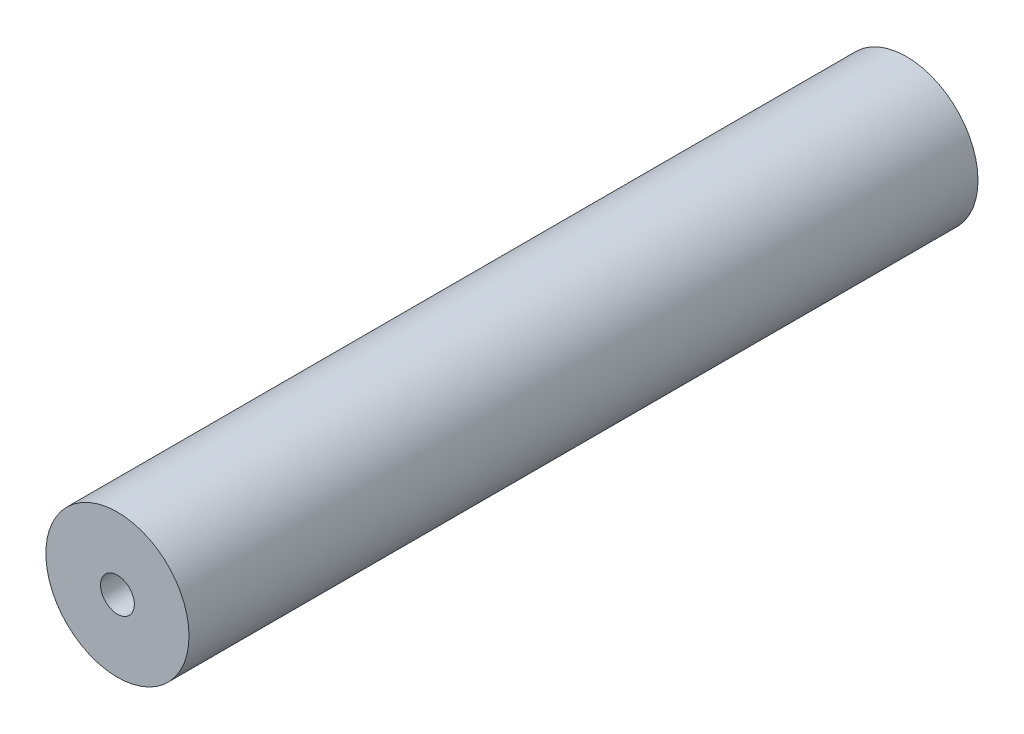
ISO-10303-21;
HEADER;
FILE_DESCRIPTION(('STEP AP214'),'2;1');
FILE_NAME('part.step','',(''),(''),'','','');
FILE_SCHEMA(('AUTOMOTIVE_DESIGN { 1 0 10303 214 1 1 1 1 }'));
ENDSEC;
DATA;
#1=APPLICATION_CONTEXT('core data for automotive mechanical design processes');
#2=APPLICATION_PROTOCOL_DEFINITION('international standard','automotive_design',2000,#1);
#3=PRODUCT_CONTEXT('',#1,'mechanical');
#4=PRODUCT('Part','Part','',(#3));
#5=PRODUCT_RELATED_PRODUCT_CATEGORY('part','',(#4));
#6=PRODUCT_DEFINITION_FORMATION('','',#4);
#7=PRODUCT_DEFINITION_CONTEXT('part definition',#1,'design');
#8=PRODUCT_DEFINITION('design','',#6,#7);
#9=PRODUCT_DEFINITION_SHAPE('','',#8);
#10=(LENGTH_UNIT() NAMED_UNIT(*) SI_UNIT(.MILLI.,.METRE.));
#11=(NAMED_UNIT(*) PLANE_ANGLE_UNIT() SI_UNIT($,.RADIAN.));
#12=(NAMED_UNIT(*) SI_UNIT($,.STERADIAN.) SOLID_ANGLE_UNIT());
#13=UNCERTAINTY_MEASURE_WITH_UNIT(LENGTH_MEASURE(1.E-05),#10,'distance_accuracy_value','');
#14=(GEOMETRIC_REPRESENTATION_CONTEXT(3) GLOBAL_UNCERTAINTY_ASSIGNED_CONTEXT((#13)) GLOBAL_UNIT_ASSIGNED_CONTEXT((#10,
#11,#12)) REPRESENTATION_CONTEXT('',''));
#15=CARTESIAN_POINT('',(0.,0.,0.));
#16=DIRECTION('',(0.,0.,1.));
#17=DIRECTION('',(1.,0.,0.));
#18=AXIS2_PLACEMENT_3D('',#15,#16,#17);
#19=CARTESIAN_POINT('',(0.,0.,70.));
#20=DIRECTION('',(0.,0.,-1.));
#21=DIRECTION('',(-1.,0.,0.));
#22=AXIS2_PLACEMENT_3D('',#19,#20,#21);
#23=CYLINDRICAL_SURFACE('',#22,6.35);
#24=CARTESIAN_POINT('',(0.,0.,70.));
#25=DIRECTION('',(0.,0.,1.));
#26=DIRECTION('',(1.,0.,0.));
#27=AXIS2_PLACEMENT_3D('',#24,#25,#26);
#28=CIRCLE('',#27,6.35);
#29=CARTESIAN_POINT('',(6.35,0.,70.));
#30=VERTEX_POINT('',#29);
#31=EDGE_CURVE('E10',#30,#30,#28,.T.);
#32=ORIENTED_EDGE('',*,*,#31,.F.);
#33=EDGE_LOOP('',(#32));
#34=FACE_BOUND('',#33,.T.);
#35=CARTESIAN_POINT('',(0.,0.,0.));
#36=DIRECTION('',(0.,0.,1.));
#37=DIRECTION('',(1.,0.,0.));
#38=AXIS2_PLACEMENT_3D('',#35,#36,#37);
#39=CIRCLE('',#38,6.35);
#40=CARTESIAN_POINT('',(6.35,0.,0.));
#41=VERTEX_POINT('',#40);
#42=EDGE_CURVE('E45',#41,#41,#39,.T.);
#43=ORIENTED_EDGE('',*,*,#42,.T.);
#44=EDGE_LOOP('',(#43));
#45=FACE_BOUND('',#44,.T.);
#46=ADVANCED_FACE('F39',(#34,#45),#23,.T.);
#47=CARTESIAN_POINT('',(0.,0.,70.));
#48=DIRECTION('',(0.,0.,1.));
#49=DIRECTION('',(1.,0.,0.));
#50=AXIS2_PLACEMENT_3D('',#47,#48,#49);
#51=PLANE('',#50);
#52=CARTESIAN_POINT('',(0.,0.,70.));
#53=DIRECTION('',(0.,0.,1.));
#54=DIRECTION('',(1.,0.,0.));
#55=AXIS2_PLACEMENT_3D('',#52,#53,#54);
#56=CIRCLE('',#55,1.5);
#57=CARTESIAN_POINT('',(1.5,0.,70.));
#58=VERTEX_POINT('',#57);
#59=EDGE_CURVE('E51',#58,#58,#56,.T.);
#60=ORIENTED_EDGE('',*,*,#59,.F.);
#61=EDGE_LOOP('',(#60));
#62=FACE_BOUND('',#61,.T.);
#63=ORIENTED_EDGE('',*,*,#31,.T.);
#64=EDGE_LOOP('',(#63));
#65=FACE_BOUND('',#64,.T.);
#66=ADVANCED_FACE('F77',(#62,#65),#51,.T.);
#67=CARTESIAN_POINT('',(0.,0.,0.));
#68=DIRECTION('',(0.,0.,1.));
#69=DIRECTION('',(1.,0.,0.));
#70=AXIS2_PLACEMENT_3D('',#67,#68,#69);
#71=PLANE('',#70);
#72=CARTESIAN_POINT('',(0.,0.,0.));
#73=DIRECTION('',(0.,0.,-1.));
#74=DIRECTION('',(-1.,0.,0.));
#75=AXIS2_PLACEMENT_3D('',#72,#73,#74);
#76=CIRCLE('',#75,1.5);
#77=CARTESIAN_POINT('',(-1.5,0.,0.));
#78=VERTEX_POINT('',#77);
#79=EDGE_CURVE('E60',#78,#78,#76,.T.);
#80=ORIENTED_EDGE('',*,*,#79,.F.);
#81=EDGE_LOOP('',(#80));
#82=FACE_BOUND('',#81,.T.);
#83=ORIENTED_EDGE('',*,*,#42,.F.);
#84=EDGE_LOOP('',(#83));
#85=FACE_BOUND('',#84,.T.);
#86=ADVANCED_FACE('F75',(#82,#85),#71,.F.);
#87=CARTESIAN_POINT('',(0.,0.,50.));
#88=DIRECTION('',(0.,0.,1.));
#89=DIRECTION('',(1.,0.,0.));
#90=AXIS2_PLACEMENT_3D('',#87,#88,#89);
#91=CYLINDRICAL_SURFACE('',#90,1.5);
#92=CARTESIAN_POINT('',(0.,0.,50.));
#93=DIRECTION('',(0.,0.,1.));
#94=DIRECTION('',(1.,0.,0.));
#95=AXIS2_PLACEMENT_3D('',#92,#93,#94);
#96=CIRCLE('',#95,1.5);
#97=CARTESIAN_POINT('',(1.5,0.,50.));
#98=VERTEX_POINT('',#97);
#99=EDGE_CURVE('E47',#98,#98,#96,.T.);
#100=ORIENTED_EDGE('',*,*,#99,.F.);
#101=EDGE_LOOP('',(#100));
#102=FACE_BOUND('',#101,.T.);
#103=ORIENTED_EDGE('',*,*,#59,.T.);
#104=EDGE_LOOP('',(#103));
#105=FACE_BOUND('',#104,.T.);
#106=ADVANCED_FACE('F73',(#102,#105),#91,.F.);
#107=CARTESIAN_POINT('',(0.,0.,50.));
#108=DIRECTION('',(0.,0.,1.));
#109=DIRECTION('',(1.,0.,0.));
#110=AXIS2_PLACEMENT_3D('',#107,#108,#109);
#111=PLANE('',#110);
#112=ORIENTED_EDGE('',*,*,#99,.T.);
#113=EDGE_LOOP('',(#112));
#114=FACE_BOUND('',#113,.T.);
#115=ADVANCED_FACE('F69',(#114),#111,.T.);
#116=CARTESIAN_POINT('',(0.,0.,20.));
#117=DIRECTION('',(0.,0.,-1.));
#118=DIRECTION('',(-1.,0.,0.));
#119=AXIS2_PLACEMENT_3D('',#116,#117,#118);
#120=CYLINDRICAL_SURFACE('',#119,1.5);
#121=CARTESIAN_POINT('',(0.,0.,20.));
#122=DIRECTION('',(0.,0.,-1.));
#123=DIRECTION('',(-1.,0.,0.));
#124=AXIS2_PLACEMENT_3D('',#121,#122,#123);
#125=CIRCLE('',#124,1.5);
#126=CARTESIAN_POINT('',(-1.5,0.,20.));
#127=VERTEX_POINT('',#126);
#128=EDGE_CURVE('E53',#127,#127,#125,.T.);
#129=ORIENTED_EDGE('',*,*,#128,.F.);
#130=EDGE_LOOP('',(#129));
#131=FACE_BOUND('',#130,.T.);
#132=ORIENTED_EDGE('',*,*,#79,.T.);
#133=EDGE_LOOP('',(#132));
#134=FACE_BOUND('',#133,.T.);
#135=ADVANCED_FACE('F63',(#131,#134),#120,.F.);
#136=CARTESIAN_POINT('',(0.,0.,20.));
#137=DIRECTION('',(0.,0.,-1.));
#138=DIRECTION('',(-1.,0.,0.));
#139=AXIS2_PLACEMENT_3D('',#136,#137,#138);
#140=PLANE('',#139);
#141=ORIENTED_EDGE('',*,*,#128,.T.);
#142=EDGE_LOOP('',(#141));
#143=FACE_BOUND('',#142,.T.);
#144=ADVANCED_FACE('F64',(#143),#140,.T.);
#145=CLOSED_SHELL('',(#46,#66,#86,#106,#115,#135,#144));
#146=MANIFOLD_SOLID_BREP('B2',#145);
#147=ADVANCED_BREP_SHAPE_REPRESENTATION('',(#18,#146),#14);
#148=SHAPE_DEFINITION_REPRESENTATION(#9,#147);
ENDSEC;
END-ISO-10303-21;
